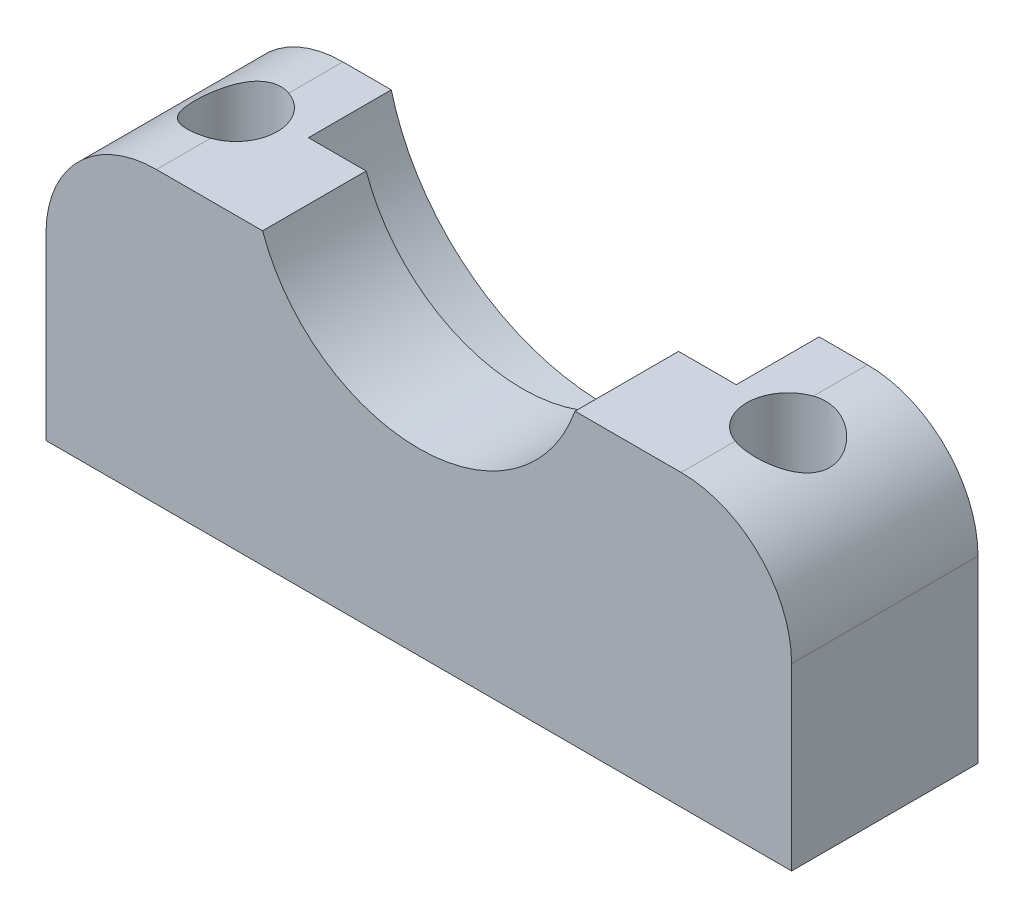
ISO-10303-21;
HEADER;
FILE_DESCRIPTION(('STEP AP214'),'2;1');
FILE_NAME('part.step','',(''),(''),'','','');
FILE_SCHEMA(('AUTOMOTIVE_DESIGN { 1 0 10303 214 1 1 1 1 }'));
ENDSEC;
DATA;
#1=APPLICATION_CONTEXT('core data for automotive mechanical design processes');
#2=APPLICATION_PROTOCOL_DEFINITION('international standard','automotive_design',2000,#1);
#3=PRODUCT_CONTEXT('',#1,'mechanical');
#4=PRODUCT('Part','Part','',(#3));
#5=PRODUCT_RELATED_PRODUCT_CATEGORY('part','',(#4));
#6=PRODUCT_DEFINITION_FORMATION('','',#4);
#7=PRODUCT_DEFINITION_CONTEXT('part definition',#1,'design');
#8=PRODUCT_DEFINITION('design','',#6,#7);
#9=PRODUCT_DEFINITION_SHAPE('','',#8);
#10=(LENGTH_UNIT() NAMED_UNIT(*) SI_UNIT(.MILLI.,.METRE.));
#11=(NAMED_UNIT(*) PLANE_ANGLE_UNIT() SI_UNIT($,.RADIAN.));
#12=(NAMED_UNIT(*) SI_UNIT($,.STERADIAN.) SOLID_ANGLE_UNIT());
#13=UNCERTAINTY_MEASURE_WITH_UNIT(LENGTH_MEASURE(1.E-05),#10,'distance_accuracy_value','');
#14=(GEOMETRIC_REPRESENTATION_CONTEXT(3) GLOBAL_UNCERTAINTY_ASSIGNED_CONTEXT((#13)) GLOBAL_UNIT_ASSIGNED_CONTEXT((#10,
#11,#12)) REPRESENTATION_CONTEXT('',''));
#15=CARTESIAN_POINT('',(0.,0.,0.));
#16=DIRECTION('',(0.,0.,1.));
#17=DIRECTION('',(1.,0.,0.));
#18=AXIS2_PLACEMENT_3D('',#15,#16,#17);
#19=CARTESIAN_POINT('',(-13.5,12.5,6.75));
#20=DIRECTION('',(0.,0.,-1.));
#21=DIRECTION('',(-1.,0.,0.));
#22=AXIS2_PLACEMENT_3D('',#19,#20,#21);
#23=CYLINDRICAL_SURFACE('',#22,6.);
#24=DIRECTION('',(0.,0.,-1.));
#25=VECTOR('',#24,1.);
#26=CARTESIAN_POINT('',(-19.1568542494924,10.5,6.75));
#27=LINE('',#26,#25);
#28=CARTESIAN_POINT('',(-19.1568542494924,10.5,6.75));
#29=VERTEX_POINT('',#28);
#30=CARTESIAN_POINT('',(-19.1568542494924,10.5,3.));
#31=VERTEX_POINT('',#30);
#32=EDGE_CURVE('E130',#29,#31,#27,.T.);
#33=ORIENTED_EDGE('',*,*,#32,.F.);
#34=CARTESIAN_POINT('',(-13.5,12.5,6.75));
#35=DIRECTION('',(0.,0.,1.));
#36=DIRECTION('',(1.,0.,0.));
#37=AXIS2_PLACEMENT_3D('',#34,#35,#36);
#38=CIRCLE('',#37,6.);
#39=CARTESIAN_POINT('',(-7.84314575050762,10.5,6.75));
#40=VERTEX_POINT('',#39);
#41=EDGE_CURVE('E145',#29,#40,#38,.T.);
#42=ORIENTED_EDGE('',*,*,#41,.T.);
#43=DIRECTION('',(0.,0.,-1.));
#44=VECTOR('',#43,1.);
#45=CARTESIAN_POINT('',(-7.84314575050762,10.5,6.75));
#46=LINE('',#45,#44);
#47=CARTESIAN_POINT('',(-7.84314575050762,10.5,3.));
#48=VERTEX_POINT('',#47);
#49=EDGE_CURVE('E355',#48,#40,#46,.F.);
#50=ORIENTED_EDGE('',*,*,#49,.F.);
#51=CARTESIAN_POINT('',(-13.5,12.5,3.));
#52=DIRECTION('',(0.,0.,-1.));
#53=DIRECTION('',(-1.,0.,0.));
#54=AXIS2_PLACEMENT_3D('',#51,#52,#53);
#55=CIRCLE('',#54,6.);
#56=EDGE_CURVE('E147',#48,#31,#55,.T.);
#57=ORIENTED_EDGE('',*,*,#56,.T.);
#58=EDGE_LOOP('',(#33,#42,#50,#57));
#59=FACE_BOUND('',#58,.T.);
#60=ADVANCED_FACE('F34',(#59),#23,.F.);
#61=CARTESIAN_POINT('',(-27.,0.,6.75));
#62=DIRECTION('',(-1.,0.,0.));
#63=DIRECTION('',(0.,-1.,0.));
#64=AXIS2_PLACEMENT_3D('',#61,#62,#63);
#65=PLANE('',#64);
#66=DIRECTION('',(0.,1.,0.));
#67=VECTOR('',#66,1.);
#68=CARTESIAN_POINT('',(-27.,0.,6.75));
#69=LINE('',#68,#67);
#70=CARTESIAN_POINT('',(-27.,0.,6.75));
#71=VERTEX_POINT('',#70);
#72=CARTESIAN_POINT('',(-27.,6.5,6.75));
#73=VERTEX_POINT('',#72);
#74=EDGE_CURVE('E153',#71,#73,#69,.T.);
#75=ORIENTED_EDGE('',*,*,#74,.T.);
#76=DIRECTION('',(0.,0.,1.));
#77=VECTOR('',#76,1.);
#78=CARTESIAN_POINT('',(-27.,6.5,0.));
#79=LINE('',#78,#77);
#80=CARTESIAN_POINT('',(-27.,6.5,0.));
#81=VERTEX_POINT('',#80);
#82=EDGE_CURVE('E350',#73,#81,#79,.F.);
#83=ORIENTED_EDGE('',*,*,#82,.T.);
#84=DIRECTION('',(0.,1.,0.));
#85=VECTOR('',#84,1.);
#86=CARTESIAN_POINT('',(-27.,0.,0.));
#87=LINE('',#86,#85);
#88=CARTESIAN_POINT('',(-27.,0.,0.));
#89=VERTEX_POINT('',#88);
#90=EDGE_CURVE('E171',#89,#81,#87,.T.);
#91=ORIENTED_EDGE('',*,*,#90,.F.);
#92=DIRECTION('',(0.,0.,-1.));
#93=VECTOR('',#92,1.);
#94=CARTESIAN_POINT('',(-27.,0.,6.75));
#95=LINE('',#94,#93);
#96=EDGE_CURVE('E177',#71,#89,#95,.T.);
#97=ORIENTED_EDGE('',*,*,#96,.F.);
#98=EDGE_LOOP('',(#75,#83,#91,#97));
#99=FACE_BOUND('',#98,.T.);
#100=ADVANCED_FACE('F242',(#99),#65,.T.);
#101=CARTESIAN_POINT('',(0.,0.,6.75));
#102=DIRECTION('',(0.,-1.,0.));
#103=DIRECTION('',(1.,0.,0.));
#104=AXIS2_PLACEMENT_3D('',#101,#102,#103);
#105=PLANE('',#104);
#106=CARTESIAN_POINT('',(-23.5,0.,3.375));
#107=DIRECTION('',(0.,-1.,0.));
#108=DIRECTION('',(1.,0.,0.));
#109=AXIS2_PLACEMENT_3D('',#106,#107,#108);
#110=CIRCLE('',#109,1.5);
#111=CARTESIAN_POINT('',(-22.,0.,3.375));
#112=VERTEX_POINT('',#111);
#113=EDGE_CURVE('E191',#112,#112,#110,.T.);
#114=ORIENTED_EDGE('',*,*,#113,.F.);
#115=EDGE_LOOP('',(#114));
#116=FACE_BOUND('',#115,.T.);
#117=CARTESIAN_POINT('',(-3.5,0.,3.375));
#118=DIRECTION('',(0.,-1.,0.));
#119=DIRECTION('',(1.,0.,0.));
#120=AXIS2_PLACEMENT_3D('',#117,#118,#119);
#121=CIRCLE('',#120,1.5);
#122=CARTESIAN_POINT('',(-2.,0.,3.375));
#123=VERTEX_POINT('',#122);
#124=EDGE_CURVE('E358',#123,#123,#121,.T.);
#125=ORIENTED_EDGE('',*,*,#124,.F.);
#126=EDGE_LOOP('',(#125));
#127=FACE_BOUND('',#126,.T.);
#128=DIRECTION('',(-1.,0.,0.));
#129=VECTOR('',#128,1.);
#130=CARTESIAN_POINT('',(0.,0.,0.));
#131=LINE('',#130,#129);
#132=CARTESIAN_POINT('',(0.,0.,0.));
#133=VERTEX_POINT('',#132);
#134=EDGE_CURVE('E160',#133,#89,#131,.T.);
#135=ORIENTED_EDGE('',*,*,#134,.F.);
#136=DIRECTION('',(0.,0.,-1.));
#137=VECTOR('',#136,1.);
#138=CARTESIAN_POINT('',(0.,0.,6.75));
#139=LINE('',#138,#137);
#140=CARTESIAN_POINT('',(0.,0.,6.75));
#141=VERTEX_POINT('',#140);
#142=EDGE_CURVE('E170',#141,#133,#139,.T.);
#143=ORIENTED_EDGE('',*,*,#142,.F.);
#144=DIRECTION('',(-1.,0.,0.));
#145=VECTOR('',#144,1.);
#146=CARTESIAN_POINT('',(0.,0.,6.75));
#147=LINE('',#146,#145);
#148=EDGE_CURVE('E157',#141,#71,#147,.T.);
#149=ORIENTED_EDGE('',*,*,#148,.T.);
#150=ORIENTED_EDGE('',*,*,#96,.T.);
#151=EDGE_LOOP('',(#135,#143,#149,#150));
#152=FACE_BOUND('',#151,.T.);
#153=ADVANCED_FACE('F238',(#116,#127,#152),#105,.T.);
#154=CARTESIAN_POINT('',(0.,0.,6.75));
#155=DIRECTION('',(-1.,0.,0.));
#156=DIRECTION('',(0.,0.,1.));
#157=AXIS2_PLACEMENT_3D('',#154,#155,#156);
#158=PLANE('',#157);
#159=DIRECTION('',(0.,1.,0.));
#160=VECTOR('',#159,1.);
#161=CARTESIAN_POINT('',(0.,0.,0.));
#162=LINE('',#161,#160);
#163=CARTESIAN_POINT('',(0.,6.5,0.));
#164=VERTEX_POINT('',#163);
#165=EDGE_CURVE('E154',#133,#164,#162,.T.);
#166=ORIENTED_EDGE('',*,*,#165,.T.);
#167=DIRECTION('',(0.,0.,1.));
#168=VECTOR('',#167,1.);
#169=CARTESIAN_POINT('',(0.,6.5,6.75));
#170=LINE('',#169,#168);
#171=CARTESIAN_POINT('',(0.,6.5,6.75));
#172=VERTEX_POINT('',#171);
#173=EDGE_CURVE('E342',#164,#172,#170,.T.);
#174=ORIENTED_EDGE('',*,*,#173,.T.);
#175=DIRECTION('',(0.,1.,0.));
#176=VECTOR('',#175,1.);
#177=CARTESIAN_POINT('',(0.,0.,6.75));
#178=LINE('',#177,#176);
#179=EDGE_CURVE('E167',#141,#172,#178,.T.);
#180=ORIENTED_EDGE('',*,*,#179,.F.);
#181=ORIENTED_EDGE('',*,*,#142,.T.);
#182=EDGE_LOOP('',(#166,#174,#180,#181));
#183=FACE_BOUND('',#182,.T.);
#184=ADVANCED_FACE('F232',(#183),#158,.F.);
#185=CARTESIAN_POINT('',(0.,0.,6.75));
#186=DIRECTION('',(0.,0.,1.));
#187=DIRECTION('',(1.,0.,0.));
#188=AXIS2_PLACEMENT_3D('',#185,#186,#187);
#189=PLANE('',#188);
#190=DIRECTION('',(1.,0.,0.));
#191=VECTOR('',#190,1.);
#192=CARTESIAN_POINT('',(0.,10.5,6.75));
#193=LINE('',#192,#191);
#194=CARTESIAN_POINT('',(-23.,10.5,6.75));
#195=VERTEX_POINT('',#194);
#196=EDGE_CURVE('E126',#195,#29,#193,.T.);
#197=ORIENTED_EDGE('',*,*,#196,.F.);
#198=CARTESIAN_POINT('',(-23.,6.5,6.75));
#199=DIRECTION('',(0.,0.,1.));
#200=DIRECTION('',(1.,0.,0.));
#201=AXIS2_PLACEMENT_3D('',#198,#199,#200);
#202=CIRCLE('',#201,4.);
#203=EDGE_CURVE('E351',#195,#73,#202,.T.);
#204=ORIENTED_EDGE('',*,*,#203,.T.);
#205=ORIENTED_EDGE('',*,*,#74,.F.);
#206=ORIENTED_EDGE('',*,*,#148,.F.);
#207=ORIENTED_EDGE('',*,*,#179,.T.);
#208=CARTESIAN_POINT('',(-4.,6.5,6.75));
#209=DIRECTION('',(0.,0.,1.));
#210=DIRECTION('',(1.,0.,0.));
#211=AXIS2_PLACEMENT_3D('',#208,#209,#210);
#212=CIRCLE('',#211,4.);
#213=CARTESIAN_POINT('',(-4.,10.5,6.75));
#214=VERTEX_POINT('',#213);
#215=EDGE_CURVE('E204',#172,#214,#212,.T.);
#216=ORIENTED_EDGE('',*,*,#215,.T.);
#217=EDGE_CURVE('E139',#40,#214,#193,.T.);
#218=ORIENTED_EDGE('',*,*,#217,.F.);
#219=ORIENTED_EDGE('',*,*,#41,.F.);
#220=EDGE_LOOP('',(#197,#204,#205,#206,#207,#216,#218,#219));
#221=FACE_BOUND('',#220,.T.);
#222=ADVANCED_FACE('F152',(#221),#189,.T.);
#223=CARTESIAN_POINT('',(0.,0.,0.));
#224=DIRECTION('',(0.,0.,1.));
#225=DIRECTION('',(1.,0.,0.));
#226=AXIS2_PLACEMENT_3D('',#223,#224,#225);
#227=PLANE('',#226);
#228=ORIENTED_EDGE('',*,*,#90,.T.);
#229=CARTESIAN_POINT('',(-23.,6.5,0.));
#230=DIRECTION('',(0.,0.,1.));
#231=DIRECTION('',(1.,0.,0.));
#232=AXIS2_PLACEMENT_3D('',#229,#230,#231);
#233=CIRCLE('',#232,4.);
#234=CARTESIAN_POINT('',(-23.,10.5,0.));
#235=VERTEX_POINT('',#234);
#236=EDGE_CURVE('E345',#81,#235,#233,.F.);
#237=ORIENTED_EDGE('',*,*,#236,.T.);
#238=DIRECTION('',(1.,0.,0.));
#239=VECTOR('',#238,1.);
#240=CARTESIAN_POINT('',(0.,10.5,0.));
#241=LINE('',#240,#239);
#242=CARTESIAN_POINT('',(-21.2459666924148,10.5,0.));
#243=VERTEX_POINT('',#242);
#244=EDGE_CURVE('E149',#235,#243,#241,.T.);
#245=ORIENTED_EDGE('',*,*,#244,.T.);
#246=CARTESIAN_POINT('',(-13.5,12.5,0.));
#247=DIRECTION('',(0.,0.,1.));
#248=DIRECTION('',(1.,0.,0.));
#249=AXIS2_PLACEMENT_3D('',#246,#247,#248);
#250=CIRCLE('',#249,8.);
#251=CARTESIAN_POINT('',(-5.75403330758517,10.5,0.));
#252=VERTEX_POINT('',#251);
#253=EDGE_CURVE('E179',#243,#252,#250,.T.);
#254=ORIENTED_EDGE('',*,*,#253,.T.);
#255=CARTESIAN_POINT('',(-4.,10.5,0.));
#256=VERTEX_POINT('',#255);
#257=EDGE_CURVE('E361',#252,#256,#241,.T.);
#258=ORIENTED_EDGE('',*,*,#257,.T.);
#259=CARTESIAN_POINT('',(-4.,6.5,0.));
#260=DIRECTION('',(0.,0.,1.));
#261=DIRECTION('',(1.,0.,0.));
#262=AXIS2_PLACEMENT_3D('',#259,#260,#261);
#263=CIRCLE('',#262,4.);
#264=EDGE_CURVE('E340',#256,#164,#263,.F.);
#265=ORIENTED_EDGE('',*,*,#264,.T.);
#266=ORIENTED_EDGE('',*,*,#165,.F.);
#267=ORIENTED_EDGE('',*,*,#134,.T.);
#268=EDGE_LOOP('',(#228,#237,#245,#254,#258,#265,#266,#267));
#269=FACE_BOUND('',#268,.T.);
#270=ADVANCED_FACE('F225',(#269),#227,.F.);
#271=CARTESIAN_POINT('',(-13.5,12.5,3.));
#272=DIRECTION('',(0.,0.,-1.));
#273=DIRECTION('',(-1.,0.,0.));
#274=AXIS2_PLACEMENT_3D('',#271,#272,#273);
#275=PLANE('',#274);
#276=DIRECTION('',(-1.,0.,0.));
#277=VECTOR('',#276,1.);
#278=CARTESIAN_POINT('',(-13.5,10.5,3.));
#279=LINE('',#278,#277);
#280=CARTESIAN_POINT('',(-5.75403330758517,10.5,3.));
#281=VERTEX_POINT('',#280);
#282=EDGE_CURVE('E138',#281,#48,#279,.T.);
#283=ORIENTED_EDGE('',*,*,#282,.F.);
#284=CARTESIAN_POINT('',(-13.5,12.5,3.));
#285=DIRECTION('',(0.,0.,-1.));
#286=DIRECTION('',(-1.,0.,0.));
#287=AXIS2_PLACEMENT_3D('',#284,#285,#286);
#288=CIRCLE('',#287,8.);
#289=CARTESIAN_POINT('',(-21.2459666924148,10.5,3.));
#290=VERTEX_POINT('',#289);
#291=EDGE_CURVE('E148',#281,#290,#288,.T.);
#292=ORIENTED_EDGE('',*,*,#291,.T.);
#293=EDGE_CURVE('E362',#31,#290,#279,.T.);
#294=ORIENTED_EDGE('',*,*,#293,.F.);
#295=ORIENTED_EDGE('',*,*,#56,.F.);
#296=EDGE_LOOP('',(#283,#292,#294,#295));
#297=FACE_BOUND('',#296,.T.);
#298=ADVANCED_FACE('F222',(#297),#275,.T.);
#299=CARTESIAN_POINT('',(-13.5,12.5,3.));
#300=DIRECTION('',(0.,0.,-1.));
#301=DIRECTION('',(-1.,0.,0.));
#302=AXIS2_PLACEMENT_3D('',#299,#300,#301);
#303=CYLINDRICAL_SURFACE('',#302,8.);
#304=ORIENTED_EDGE('',*,*,#253,.F.);
#305=DIRECTION('',(0.,0.,-1.));
#306=VECTOR('',#305,1.);
#307=CARTESIAN_POINT('',(-21.2459666924148,10.5,3.));
#308=LINE('',#307,#306);
#309=EDGE_CURVE('E185',#243,#290,#308,.F.);
#310=ORIENTED_EDGE('',*,*,#309,.T.);
#311=ORIENTED_EDGE('',*,*,#291,.F.);
#312=DIRECTION('',(0.,0.,-1.));
#313=VECTOR('',#312,1.);
#314=CARTESIAN_POINT('',(-5.75403330758517,10.5,3.));
#315=LINE('',#314,#313);
#316=EDGE_CURVE('E182',#281,#252,#315,.T.);
#317=ORIENTED_EDGE('',*,*,#316,.T.);
#318=EDGE_LOOP('',(#304,#310,#311,#317));
#319=FACE_BOUND('',#318,.T.);
#320=ADVANCED_FACE('F221',(#319),#303,.F.);
#321=CARTESIAN_POINT('',(0.,10.5,-2.25));
#322=DIRECTION('',(0.,-1.,0.));
#323=DIRECTION('',(1.,0.,0.));
#324=AXIS2_PLACEMENT_3D('',#321,#322,#323);
#325=PLANE('',#324);
#326=ORIENTED_EDGE('',*,*,#217,.T.);
#327=DIRECTION('',(0.,0.,1.));
#328=VECTOR('',#327,1.);
#329=CARTESIAN_POINT('',(-4.,10.5,-2.25));
#330=LINE('',#329,#328);
#331=CARTESIAN_POINT('',(-4.,10.5,4.7892135623731));
#332=VERTEX_POINT('',#331);
#333=EDGE_CURVE('E48',#214,#332,#330,.F.);
#334=ORIENTED_EDGE('',*,*,#333,.T.);
#335=CARTESIAN_POINT('',(-3.5,10.5,3.375));
#336=DIRECTION('',(0.,-1.,0.));
#337=DIRECTION('',(1.,0.,0.));
#338=AXIS2_PLACEMENT_3D('',#335,#336,#337);
#339=CIRCLE('',#338,1.5);
#340=CARTESIAN_POINT('',(-4.,10.5,1.9607864376269));
#341=VERTEX_POINT('',#340);
#342=EDGE_CURVE('E190',#332,#341,#339,.T.);
#343=ORIENTED_EDGE('',*,*,#342,.T.);
#344=DIRECTION('',(0.,0.,1.));
#345=VECTOR('',#344,1.);
#346=CARTESIAN_POINT('',(-4.,10.5,-2.25));
#347=LINE('',#346,#345);
#348=EDGE_CURVE('E338',#341,#256,#347,.F.);
#349=ORIENTED_EDGE('',*,*,#348,.T.);
#350=ORIENTED_EDGE('',*,*,#257,.F.);
#351=ORIENTED_EDGE('',*,*,#316,.F.);
#352=ORIENTED_EDGE('',*,*,#282,.T.);
#353=ORIENTED_EDGE('',*,*,#49,.T.);
#354=EDGE_LOOP('',(#326,#334,#343,#349,#350,#351,#352,#353));
#355=FACE_BOUND('',#354,.T.);
#356=ADVANCED_FACE('F218',(#355),#325,.F.);
#357=ORIENTED_EDGE('',*,*,#244,.F.);
#358=DIRECTION('',(0.,0.,1.));
#359=VECTOR('',#358,1.);
#360=CARTESIAN_POINT('',(-23.,10.5,6.75));
#361=LINE('',#360,#359);
#362=CARTESIAN_POINT('',(-23.,10.5,1.9607864376269));
#363=VERTEX_POINT('',#362);
#364=EDGE_CURVE('E194',#235,#363,#361,.T.);
#365=ORIENTED_EDGE('',*,*,#364,.T.);
#366=CARTESIAN_POINT('',(-23.5,10.5,3.375));
#367=DIRECTION('',(0.,-1.,0.));
#368=DIRECTION('',(1.,0.,0.));
#369=AXIS2_PLACEMENT_3D('',#366,#367,#368);
#370=CIRCLE('',#369,1.5);
#371=CARTESIAN_POINT('',(-23.,10.5,4.7892135623731));
#372=VERTEX_POINT('',#371);
#373=EDGE_CURVE('E188',#363,#372,#370,.T.);
#374=ORIENTED_EDGE('',*,*,#373,.T.);
#375=DIRECTION('',(0.,0.,1.));
#376=VECTOR('',#375,1.);
#377=CARTESIAN_POINT('',(-23.,10.5,6.75));
#378=LINE('',#377,#376);
#379=EDGE_CURVE('E134',#372,#195,#378,.T.);
#380=ORIENTED_EDGE('',*,*,#379,.T.);
#381=ORIENTED_EDGE('',*,*,#196,.T.);
#382=ORIENTED_EDGE('',*,*,#32,.T.);
#383=ORIENTED_EDGE('',*,*,#293,.T.);
#384=ORIENTED_EDGE('',*,*,#309,.F.);
#385=EDGE_LOOP('',(#357,#365,#374,#380,#381,#382,#383,#384));
#386=FACE_BOUND('',#385,.T.);
#387=ADVANCED_FACE('F129',(#386),#325,.F.);
#388=CARTESIAN_POINT('',(-23.5,16.,3.375));
#389=DIRECTION('',(0.,-1.,0.));
#390=DIRECTION('',(1.,0.,0.));
#391=AXIS2_PLACEMENT_3D('',#388,#389,#390);
#392=CYLINDRICAL_SURFACE('',#391,1.5);
#393=ORIENTED_EDGE('',*,*,#113,.T.);
#394=EDGE_LOOP('',(#393));
#395=FACE_BOUND('',#394,.T.);
#396=ORIENTED_EDGE('',*,*,#373,.F.);
#397=CARTESIAN_POINT('',(-23.,10.5,1.9607864376269));
#398=CARTESIAN_POINT('',(-23.0378319832155,10.5000023960205,1.94740987708835));
#399=CARTESIAN_POINT('',(-23.0761849195276,10.499462492245,1.93556013709208));
#400=CARTESIAN_POINT('',(-23.1536817238485,10.4972344087846,1.91497532391856));
#401=CARTESIAN_POINT('',(-23.192825532563,10.4955463148754,1.90624001815115));
#402=CARTESIAN_POINT('',(-23.3107978699076,10.488680291099,1.88484496217661));
#403=CARTESIAN_POINT('',(-23.3904372503122,10.4817015033505,1.87690110022407));
#404=CARTESIAN_POINT('',(-23.5493703017306,10.4629043254003,1.87370281438772));
#405=CARTESIAN_POINT('',(-23.6286638531235,10.4510843770191,1.87845247877367));
#406=CARTESIAN_POINT('',(-23.7847678210828,10.4230638884984,1.90017170215322));
#407=CARTESIAN_POINT('',(-23.861577618519,10.4068622654118,1.91714428381276));
#408=CARTESIAN_POINT('',(-24.0125704522464,10.3705134072633,1.96303541805386));
#409=CARTESIAN_POINT('',(-24.0866521271973,10.3502838310809,1.99222031720811));
#410=CARTESIAN_POINT('',(-24.2287327725192,10.3073262905761,2.06152995930019));
#411=CARTESIAN_POINT('',(-24.296728715158,10.2845970950551,2.10166010790208));
#412=CARTESIAN_POINT('',(-24.4304479248761,10.2362098079906,2.19540304086512));
#413=CARTESIAN_POINT('',(-24.4955694217961,10.2104620785071,2.24982932821593));
#414=CARTESIAN_POINT('',(-24.6159030232071,10.1596626989638,2.36904793505705));
#415=CARTESIAN_POINT('',(-24.6711099935825,10.1346114151922,2.43384559257655));
#416=CARTESIAN_POINT('',(-24.7719977489546,10.0865389971983,2.57511048985045));
#417=CARTESIAN_POINT('',(-24.8172588530828,10.063624889974,2.65191653550681));
#418=CARTESIAN_POINT('',(-24.8938316823481,10.023533003501,2.81356482147389));
#419=CARTESIAN_POINT('',(-24.9251569081314,10.006349676509,2.89839918712523));
#420=CARTESIAN_POINT('',(-24.9701252792281,9.98126657535987,3.06585004545837));
#421=CARTESIAN_POINT('',(-24.9850765675282,9.97268564133896,3.14801026583185));
#422=CARTESIAN_POINT('',(-25.0010769629969,9.9634934230368,3.31408850740847));
#423=CARTESIAN_POINT('',(-25.0021378387065,9.96287539225651,3.39800498024862));
#424=CARTESIAN_POINT('',(-24.9909911514778,9.96929056969859,3.55512834424229));
#425=CARTESIAN_POINT('',(-24.9802568146482,9.97547432156045,3.62848176935523));
#426=CARTESIAN_POINT('',(-24.9483390224926,9.99346639855836,3.77215363037803));
#427=CARTESIAN_POINT('',(-24.9271531784361,10.0052760094839,3.84247136847306));
#428=CARTESIAN_POINT('',(-24.8745552423506,10.0336879238743,3.98011111223491));
#429=CARTESIAN_POINT('',(-24.8429100595446,10.0503983871593,4.04732081146079));
#430=CARTESIAN_POINT('',(-24.7705558886852,10.0870285889435,4.17570184338351));
#431=CARTESIAN_POINT('',(-24.7298433758413,10.1069495746513,4.23687081445269));
#432=CARTESIAN_POINT('',(-24.6348352310969,10.1510785750847,4.35930737791359));
#433=CARTESIAN_POINT('',(-24.5794891704797,10.1755132196991,4.41967958773666));
#434=CARTESIAN_POINT('',(-24.4597897519909,10.2246748613,4.53062527354508));
#435=CARTESIAN_POINT('',(-24.3954309719051,10.2494020260118,4.58119280686449));
#436=CARTESIAN_POINT('',(-24.2538055866462,10.2992120080795,4.67481115954185));
#437=CARTESIAN_POINT('',(-24.1759322765211,10.3241817499288,4.71701081688022));
#438=CARTESIAN_POINT('',(-24.0130624339363,10.3705113673106,4.78731152903659));
#439=CARTESIAN_POINT('',(-23.9280686201886,10.3918726113078,4.81541793648843));
#440=CARTESIAN_POINT('',(-23.756889687431,10.4286726742671,4.85534314738412));
#441=CARTESIAN_POINT('',(-23.670892838456,10.4443166304953,4.8677765564159));
#442=CARTESIAN_POINT('',(-23.4972288411973,10.4699421337877,4.8775089299154));
#443=CARTESIAN_POINT('',(-23.4095634067551,10.4799291977032,4.87482266782157));
#444=CARTESIAN_POINT('',(-23.2677801223683,10.4914082642857,4.85794847935411));
#445=CARTESIAN_POINT('',(-23.213212157416,10.4946748182471,4.84836710906705));
#446=CARTESIAN_POINT('',(-23.1054283695219,10.4989769250386,4.82323335287173));
#447=CARTESIAN_POINT('',(-23.0522114231144,10.5000143958501,4.80768611379546));
#448=CARTESIAN_POINT('',(-23.,10.5,4.7892135623731));
#449=B_SPLINE_CURVE_WITH_KNOTS('',3,(#397,#398,#399,#400,#401,#402,#403,#404,#405,#406,#407,
#408,#409,#410,#411,#412,#413,#414,#415,#416,#417,#418,#419,#420,#421,#422,#423,#424,#425,#426,
#427,#428,#429,#430,#431,#432,#433,#434,#435,#436,#437,#438,#439,#440,#441,#442,#443,#444,#445,
#446,#447,#448),.UNSPECIFIED.,.F.,.F.,(4,2,2,2,2,2,2,2,2,2,2,2,2,2,2,2,2,2,2,2,2,2,2,2,2,4),(0.,
0.120309329345876,0.240609671945858,0.480363075352819,0.720193706685026,0.960083667300783,
1.20550329603895,1.45104435334003,1.71594286488899,1.98097815779878,2.25565644398619,
2.53006804781032,2.78045075843437,3.03062132056753,3.25276378324799,3.47495704094256,
3.70247965257162,3.93009086511286,4.18542417425257,4.44091176176855,4.71561106476723,
4.99020595745394,5.25365899583674,5.51685465883552,5.68299597047867,5.84899427095039),.UNSPECIFIED.);
#450=EDGE_CURVE('E197',#363,#372,#449,.T.);
#451=ORIENTED_EDGE('',*,*,#450,.T.);
#452=EDGE_LOOP('',(#396,#451));
#453=FACE_BOUND('',#452,.T.);
#454=ADVANCED_FACE('F209',(#395,#453),#392,.F.);
#455=CARTESIAN_POINT('',(-3.5,16.,3.375));
#456=DIRECTION('',(0.,-1.,0.));
#457=DIRECTION('',(1.,0.,0.));
#458=AXIS2_PLACEMENT_3D('',#455,#456,#457);
#459=CYLINDRICAL_SURFACE('',#458,1.5);
#460=ORIENTED_EDGE('',*,*,#124,.T.);
#461=EDGE_LOOP('',(#460));
#462=FACE_BOUND('',#461,.T.);
#463=ORIENTED_EDGE('',*,*,#342,.F.);
#464=CARTESIAN_POINT('',(-4.,10.5,4.7892135623731));
#465=CARTESIAN_POINT('',(-3.96216801678447,10.5000023960205,4.80259012291165));
#466=CARTESIAN_POINT('',(-3.92381508047237,10.4994624922451,4.81443986290792));
#467=CARTESIAN_POINT('',(-3.84631827615155,10.4972344087846,4.83502467608144));
#468=CARTESIAN_POINT('',(-3.80717446743704,10.4955463148754,4.84375998184885));
#469=CARTESIAN_POINT('',(-3.68920213009239,10.488680291099,4.86515503782339));
#470=CARTESIAN_POINT('',(-3.60956274968784,10.4817015033505,4.87309889977593));
#471=CARTESIAN_POINT('',(-3.45062969826937,10.4629043254003,4.87629718561228));
#472=CARTESIAN_POINT('',(-3.37133614687646,10.4510843770191,4.87154752122633));
#473=CARTESIAN_POINT('',(-3.21523217891716,10.4230638884984,4.84982829784678));
#474=CARTESIAN_POINT('',(-3.138422381481,10.4068622654118,4.83285571618724));
#475=CARTESIAN_POINT('',(-2.98742954775357,10.3705134072633,4.78696458194615));
#476=CARTESIAN_POINT('',(-2.91334787280273,10.3502838310809,4.75777968279189));
#477=CARTESIAN_POINT('',(-2.77126722748079,10.3073262905761,4.68847004069982));
#478=CARTESIAN_POINT('',(-2.70327128484197,10.2845970950551,4.64833989209792));
#479=CARTESIAN_POINT('',(-2.56955207512394,10.2362098079906,4.55459695913488));
#480=CARTESIAN_POINT('',(-2.50443057820388,10.2104620785071,4.50017067178408));
#481=CARTESIAN_POINT('',(-2.38409697679291,10.1596626989638,4.38095206494295));
#482=CARTESIAN_POINT('',(-2.32889000641751,10.1346114151922,4.31615440742345));
#483=CARTESIAN_POINT('',(-2.22800225104545,10.0865389971983,4.17488951014955));
#484=CARTESIAN_POINT('',(-2.18274114691722,10.0636248899741,4.09808346449319));
#485=CARTESIAN_POINT('',(-2.10616831765192,10.023533003501,3.93643517852611));
#486=CARTESIAN_POINT('',(-2.07484309186856,10.006349676509,3.85160081287477));
#487=CARTESIAN_POINT('',(-2.02987472077193,9.98126657535987,3.68414995454163));
#488=CARTESIAN_POINT('',(-2.01492343247182,9.97268564133896,3.60198973416815));
#489=CARTESIAN_POINT('',(-1.99892303700314,9.9634934230368,3.43591149259154));
#490=CARTESIAN_POINT('',(-1.99786216129351,9.96287539225651,3.35199501975138));
#491=CARTESIAN_POINT('',(-2.00900884852218,9.96929056969859,3.19487165575771));
#492=CARTESIAN_POINT('',(-2.01974318535176,9.97547432156045,3.12151823064477));
#493=CARTESIAN_POINT('',(-2.05166097750742,9.99346639855836,2.97784636962197));
#494=CARTESIAN_POINT('',(-2.07284682156386,10.005276009484,2.90752863152695));
#495=CARTESIAN_POINT('',(-2.12544475764938,10.0336879238743,2.7698888877651));
#496=CARTESIAN_POINT('',(-2.15708994045544,10.0503983871593,2.70267918853921));
#497=CARTESIAN_POINT('',(-2.22944411131478,10.0870285889435,2.57429815661649));
#498=CARTESIAN_POINT('',(-2.2701566241587,10.1069495746513,2.51312918554731));
#499=CARTESIAN_POINT('',(-2.36516476890307,10.1510785750847,2.39069262208641));
#500=CARTESIAN_POINT('',(-2.4205108295203,10.1755132196991,2.33032041226334));
#501=CARTESIAN_POINT('',(-2.54021024800909,10.2246748613,2.21937472645492));
#502=CARTESIAN_POINT('',(-2.60456902809491,10.2494020260118,2.16880719313551));
#503=CARTESIAN_POINT('',(-2.74619441335377,10.2992120080795,2.07518884045815));
#504=CARTESIAN_POINT('',(-2.82406772347893,10.3241817499288,2.03298918311978));
#505=CARTESIAN_POINT('',(-2.98693756606374,10.3705113673106,1.96268847096341));
#506=CARTESIAN_POINT('',(-3.0719313798114,10.3918726113078,1.93458206351157));
#507=CARTESIAN_POINT('',(-3.24311031256902,10.4286726742671,1.89465685261588));
#508=CARTESIAN_POINT('',(-3.32910716154398,10.4443166304953,1.8822234435841));
#509=CARTESIAN_POINT('',(-3.50277115880275,10.4699421337877,1.87249107008461));
#510=CARTESIAN_POINT('',(-3.59043659324487,10.4799291977032,1.87517733217843));
#511=CARTESIAN_POINT('',(-3.7322198776317,10.4914082642857,1.89205152064589));
#512=CARTESIAN_POINT('',(-3.78678784258395,10.4946748182471,1.90163289093295));
#513=CARTESIAN_POINT('',(-3.89457163047814,10.4989769250386,1.92676664712827));
#514=CARTESIAN_POINT('',(-3.94778857688557,10.5000143958501,1.94231388620455));
#515=CARTESIAN_POINT('',(-4.,10.5,1.9607864376269));
#516=B_SPLINE_CURVE_WITH_KNOTS('',3,(#464,#465,#466,#467,#468,#469,#470,#471,#472,#473,#474,
#475,#476,#477,#478,#479,#480,#481,#482,#483,#484,#485,#486,#487,#488,#489,#490,#491,#492,#493,
#494,#495,#496,#497,#498,#499,#500,#501,#502,#503,#504,#505,#506,#507,#508,#509,#510,#511,#512,
#513,#514,#515),.UNSPECIFIED.,.F.,.F.,(4,2,2,2,2,2,2,2,2,2,2,2,2,2,2,2,2,2,2,2,2,2,2,2,2,4),(0.,
0.120309329345877,0.240609671945858,0.480363075352819,0.720193706685023,0.960083667300781,
1.20550329603895,1.45104435334003,1.71594286488898,1.98097815779877,2.25565644398618,
2.53006804781032,2.78045075843437,3.03062132056753,3.25276378324799,3.47495704094256,
3.70247965257162,3.93009086511286,4.18542417425256,4.44091176176856,4.71561106476723,
4.99020595745394,5.25365899583673,5.51685465883552,5.68299597047867,5.84899427095039),.UNSPECIFIED.);
#517=EDGE_CURVE('E11',#332,#341,#516,.T.);
#518=ORIENTED_EDGE('',*,*,#517,.T.);
#519=EDGE_LOOP('',(#463,#518));
#520=FACE_BOUND('',#519,.T.);
#521=ADVANCED_FACE('F212',(#462,#520),#459,.F.);
#522=CARTESIAN_POINT('',(-23.,6.5,-2.25));
#523=DIRECTION('',(0.,0.,-1.));
#524=DIRECTION('',(-1.,0.,0.));
#525=AXIS2_PLACEMENT_3D('',#522,#523,#524);
#526=CYLINDRICAL_SURFACE('',#525,4.);
#527=ORIENTED_EDGE('',*,*,#236,.F.);
#528=ORIENTED_EDGE('',*,*,#82,.F.);
#529=ORIENTED_EDGE('',*,*,#203,.F.);
#530=ORIENTED_EDGE('',*,*,#379,.F.);
#531=ORIENTED_EDGE('',*,*,#450,.F.);
#532=ORIENTED_EDGE('',*,*,#364,.F.);
#533=EDGE_LOOP('',(#527,#528,#529,#530,#531,#532));
#534=FACE_BOUND('',#533,.T.);
#535=ADVANCED_FACE('F206',(#534),#526,.T.);
#536=CARTESIAN_POINT('',(-4.,6.5,6.75));
#537=DIRECTION('',(0.,0.,1.));
#538=DIRECTION('',(1.,0.,0.));
#539=AXIS2_PLACEMENT_3D('',#536,#537,#538);
#540=CYLINDRICAL_SURFACE('',#539,4.);
#541=ORIENTED_EDGE('',*,*,#517,.F.);
#542=ORIENTED_EDGE('',*,*,#333,.F.);
#543=ORIENTED_EDGE('',*,*,#215,.F.);
#544=ORIENTED_EDGE('',*,*,#173,.F.);
#545=ORIENTED_EDGE('',*,*,#264,.F.);
#546=ORIENTED_EDGE('',*,*,#348,.F.);
#547=EDGE_LOOP('',(#541,#542,#543,#544,#545,#546));
#548=FACE_BOUND('',#547,.T.);
#549=ADVANCED_FACE('F36',(#548),#540,.T.);
#550=CLOSED_SHELL('',(#60,#100,#153,#184,#222,#270,#298,#320,#356,#387,#454,#521,#535,#549));
#551=MANIFOLD_SOLID_BREP('B2',#550);
#552=ADVANCED_BREP_SHAPE_REPRESENTATION('',(#18,#551),#14);
#553=SHAPE_DEFINITION_REPRESENTATION(#9,#552);
ENDSEC;
END-ISO-10303-21;
